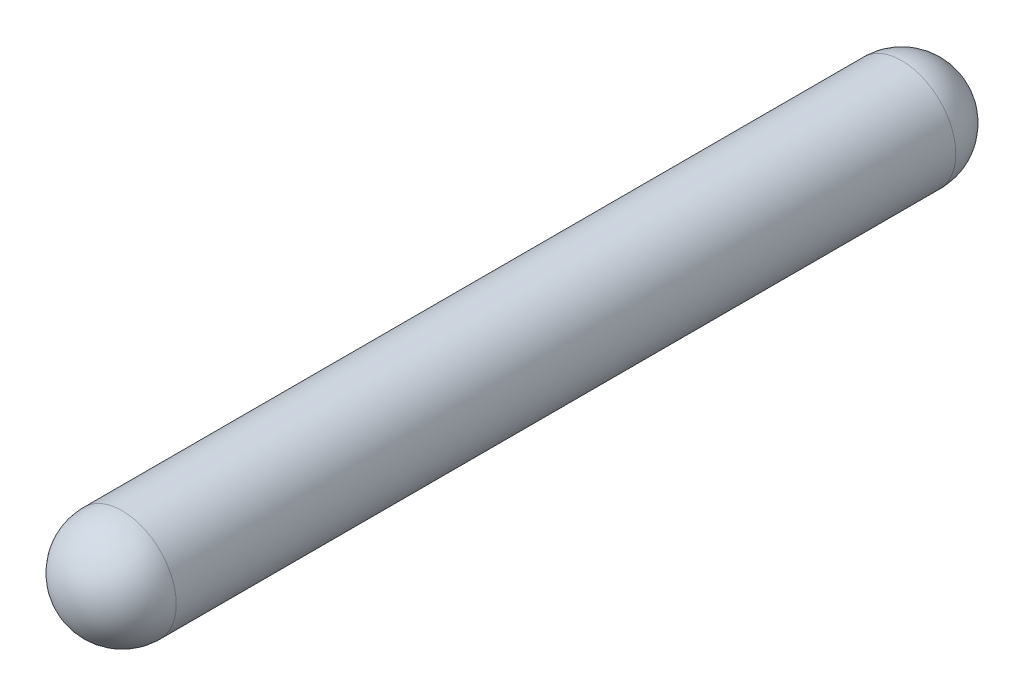
ISO-10303-21;
HEADER;
FILE_DESCRIPTION(('STEP AP214'),'2;1');
FILE_NAME('part.step','',(''),(''),'','','');
FILE_SCHEMA(('AUTOMOTIVE_DESIGN { 1 0 10303 214 1 1 1 1 }'));
ENDSEC;
DATA;
#1=APPLICATION_CONTEXT('core data for automotive mechanical design processes');
#2=APPLICATION_PROTOCOL_DEFINITION('international standard','automotive_design',2000,#1);
#3=PRODUCT_CONTEXT('',#1,'mechanical');
#4=PRODUCT('Part','Part','',(#3));
#5=PRODUCT_RELATED_PRODUCT_CATEGORY('part','',(#4));
#6=PRODUCT_DEFINITION_FORMATION('','',#4);
#7=PRODUCT_DEFINITION_CONTEXT('part definition',#1,'design');
#8=PRODUCT_DEFINITION('design','',#6,#7);
#9=PRODUCT_DEFINITION_SHAPE('','',#8);
#10=(LENGTH_UNIT() NAMED_UNIT(*) SI_UNIT(.MILLI.,.METRE.));
#11=(NAMED_UNIT(*) PLANE_ANGLE_UNIT() SI_UNIT($,.RADIAN.));
#12=(NAMED_UNIT(*) SI_UNIT($,.STERADIAN.) SOLID_ANGLE_UNIT());
#13=UNCERTAINTY_MEASURE_WITH_UNIT(LENGTH_MEASURE(1.E-05),#10,'distance_accuracy_value','');
#14=(GEOMETRIC_REPRESENTATION_CONTEXT(3) GLOBAL_UNCERTAINTY_ASSIGNED_CONTEXT((#13)) GLOBAL_UNIT_ASSIGNED_CONTEXT((#10,
#11,#12)) REPRESENTATION_CONTEXT('',''));
#15=CARTESIAN_POINT('',(0.,0.,0.));
#16=DIRECTION('',(0.,0.,1.));
#17=DIRECTION('',(1.,0.,0.));
#18=AXIS2_PLACEMENT_3D('',#15,#16,#17);
#19=CARTESIAN_POINT('',(0.,0.,-3.));
#20=DIRECTION('',(1.,0.,0.));
#21=DIRECTION('',(0.,-1.,0.));
#22=AXIS2_PLACEMENT_3D('',#19,#20,#21);
#23=SPHERICAL_SURFACE('',#22,0.45);
#24=CARTESIAN_POINT('',(0.,0.,-3.));
#25=DIRECTION('',(0.,0.,1.));
#26=DIRECTION('',(1.,0.,0.));
#27=AXIS2_PLACEMENT_3D('',#24,#25,#26);
#28=CIRCLE('',#27,0.45);
#29=CARTESIAN_POINT('',(0.45,0.,-3.));
#30=VERTEX_POINT('',#29);
#31=CARTESIAN_POINT('',(-0.45,0.,-3.));
#32=VERTEX_POINT('',#31);
#33=EDGE_CURVE('E42',#30,#32,#28,.T.);
#34=ORIENTED_EDGE('',*,*,#33,.F.);
#35=CARTESIAN_POINT('',(0.,0.,-3.));
#36=DIRECTION('',(0.,0.,1.));
#37=DIRECTION('',(1.,0.,0.));
#38=AXIS2_PLACEMENT_3D('',#35,#36,#37);
#39=CIRCLE('',#38,0.45);
#40=EDGE_CURVE('E26',#32,#30,#39,.T.);
#41=ORIENTED_EDGE('',*,*,#40,.F.);
#42=EDGE_LOOP('',(#34,#41));
#43=FACE_BOUND('',#42,.T.);
#44=ADVANCED_FACE('F17',(#43),#23,.T.);
#45=CARTESIAN_POINT('',(0.,0.,3.5));
#46=DIRECTION('',(1.,0.,0.));
#47=DIRECTION('',(0.,1.,0.));
#48=AXIS2_PLACEMENT_3D('',#45,#46,#47);
#49=SPHERICAL_SURFACE('',#48,0.45);
#50=CARTESIAN_POINT('',(0.,0.,3.5));
#51=DIRECTION('',(0.,0.,1.));
#52=DIRECTION('',(1.,0.,0.));
#53=AXIS2_PLACEMENT_3D('',#50,#51,#52);
#54=CIRCLE('',#53,0.45);
#55=CARTESIAN_POINT('',(0.45,0.,3.5));
#56=VERTEX_POINT('',#55);
#57=CARTESIAN_POINT('',(-0.45,0.,3.5));
#58=VERTEX_POINT('',#57);
#59=EDGE_CURVE('E11',#56,#58,#54,.F.);
#60=ORIENTED_EDGE('',*,*,#59,.F.);
#61=CARTESIAN_POINT('',(0.,0.,3.5));
#62=DIRECTION('',(0.,0.,1.));
#63=DIRECTION('',(1.,0.,0.));
#64=AXIS2_PLACEMENT_3D('',#61,#62,#63);
#65=CIRCLE('',#64,0.45);
#66=EDGE_CURVE('E34',#58,#56,#65,.F.);
#67=ORIENTED_EDGE('',*,*,#66,.F.);
#68=EDGE_LOOP('',(#60,#67));
#69=FACE_BOUND('',#68,.T.);
#70=ADVANCED_FACE('F49',(#69),#49,.T.);
#71=CARTESIAN_POINT('',(0.,0.,-3.));
#72=DIRECTION('',(0.,0.,1.));
#73=DIRECTION('',(1.,0.,0.));
#74=AXIS2_PLACEMENT_3D('',#71,#72,#73);
#75=CYLINDRICAL_SURFACE('',#74,0.45);
#76=ORIENTED_EDGE('',*,*,#66,.T.);
#77=ORIENTED_EDGE('',*,*,#59,.T.);
#78=EDGE_LOOP('',(#76,#77));
#79=FACE_BOUND('',#78,.T.);
#80=ORIENTED_EDGE('',*,*,#40,.T.);
#81=ORIENTED_EDGE('',*,*,#33,.T.);
#82=EDGE_LOOP('',(#80,#81));
#83=FACE_BOUND('',#82,.T.);
#84=ADVANCED_FACE('F45',(#79,#83),#75,.T.);
#85=CLOSED_SHELL('',(#44,#70,#84));
#86=MANIFOLD_SOLID_BREP('B1',#85);
#87=ADVANCED_BREP_SHAPE_REPRESENTATION('',(#18,#86),#14);
#88=SHAPE_DEFINITION_REPRESENTATION(#9,#87);
ENDSEC;
END-ISO-10303-21;
